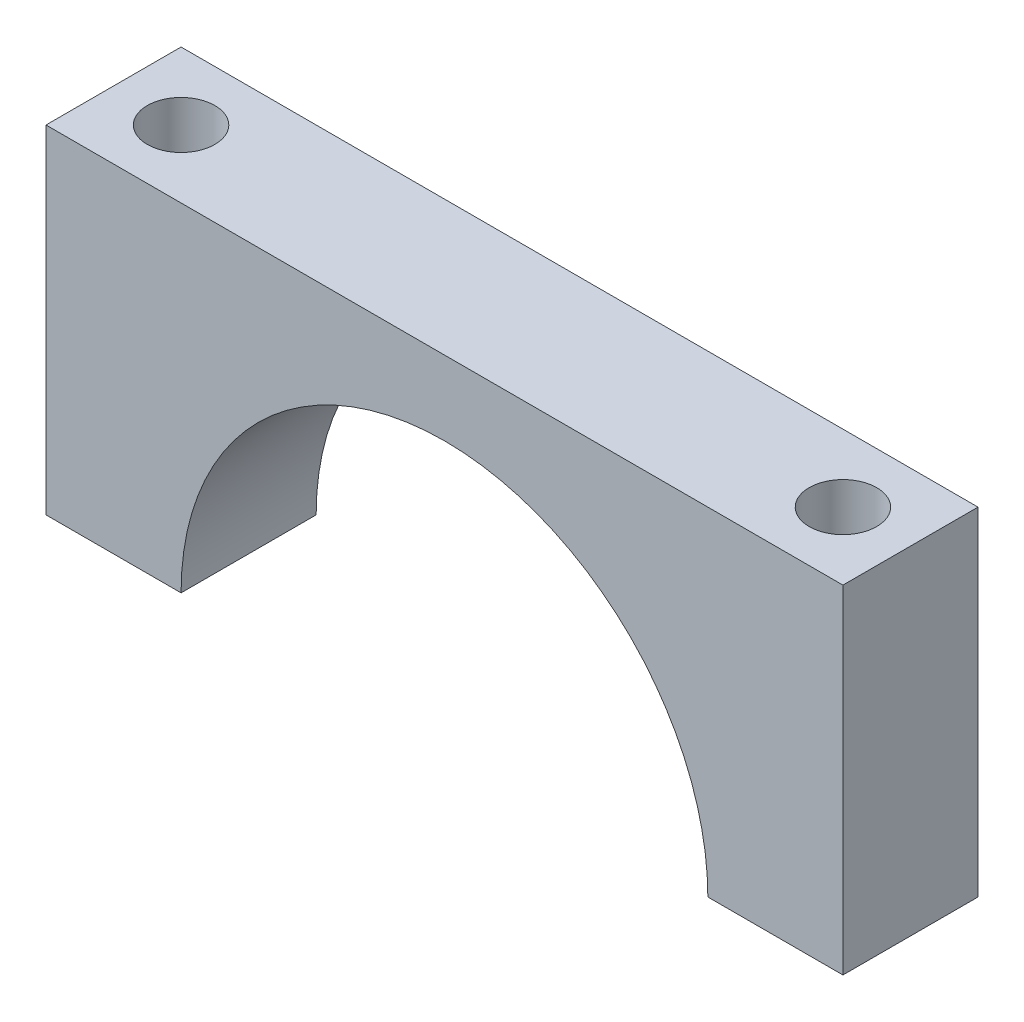
ISO-10303-21;
HEADER;
FILE_DESCRIPTION(('STEP AP214'),'2;1');
FILE_NAME('part.step','',(''),(''),'','','');
FILE_SCHEMA(('AUTOMOTIVE_DESIGN { 1 0 10303 214 1 1 1 1 }'));
ENDSEC;
DATA;
#1=APPLICATION_CONTEXT('core data for automotive mechanical design processes');
#2=APPLICATION_PROTOCOL_DEFINITION('international standard','automotive_design',2000,#1);
#3=PRODUCT_CONTEXT('',#1,'mechanical');
#4=PRODUCT('Part','Part','',(#3));
#5=PRODUCT_RELATED_PRODUCT_CATEGORY('part','',(#4));
#6=PRODUCT_DEFINITION_FORMATION('','',#4);
#7=PRODUCT_DEFINITION_CONTEXT('part definition',#1,'design');
#8=PRODUCT_DEFINITION('design','',#6,#7);
#9=PRODUCT_DEFINITION_SHAPE('','',#8);
#10=(LENGTH_UNIT() NAMED_UNIT(*) SI_UNIT(.MILLI.,.METRE.));
#11=(NAMED_UNIT(*) PLANE_ANGLE_UNIT() SI_UNIT($,.RADIAN.));
#12=(NAMED_UNIT(*) SI_UNIT($,.STERADIAN.) SOLID_ANGLE_UNIT());
#13=UNCERTAINTY_MEASURE_WITH_UNIT(LENGTH_MEASURE(1.E-05),#10,'distance_accuracy_value','');
#14=(GEOMETRIC_REPRESENTATION_CONTEXT(3) GLOBAL_UNCERTAINTY_ASSIGNED_CONTEXT((#13)) GLOBAL_UNIT_ASSIGNED_CONTEXT((#10,
#11,#12)) REPRESENTATION_CONTEXT('',''));
#15=CARTESIAN_POINT('',(0.,0.,0.));
#16=DIRECTION('',(0.,0.,1.));
#17=DIRECTION('',(1.,0.,0.));
#18=AXIS2_PLACEMENT_3D('',#15,#16,#17);
#19=CARTESIAN_POINT('',(0.,0.,10.));
#20=DIRECTION('',(0.,0.,-1.));
#21=DIRECTION('',(-1.,0.,0.));
#22=AXIS2_PLACEMENT_3D('',#19,#20,#21);
#23=CYLINDRICAL_SURFACE('',#22,19.5);
#24=CARTESIAN_POINT('',(0.,0.,0.));
#25=DIRECTION('',(0.,0.,-1.));
#26=DIRECTION('',(-1.,0.,0.));
#27=AXIS2_PLACEMENT_3D('',#24,#25,#26);
#28=CIRCLE('',#27,19.5);
#29=CARTESIAN_POINT('',(-19.5,0.,0.));
#30=VERTEX_POINT('',#29);
#31=CARTESIAN_POINT('',(19.5,0.,0.));
#32=VERTEX_POINT('',#31);
#33=EDGE_CURVE('E116',#30,#32,#28,.T.);
#34=ORIENTED_EDGE('',*,*,#33,.T.);
#35=DIRECTION('',(0.,0.,-1.));
#36=VECTOR('',#35,1.);
#37=CARTESIAN_POINT('',(19.5,0.,10.));
#38=LINE('',#37,#36);
#39=CARTESIAN_POINT('',(19.5,0.,10.));
#40=VERTEX_POINT('',#39);
#41=EDGE_CURVE('E11',#40,#32,#38,.T.);
#42=ORIENTED_EDGE('',*,*,#41,.F.);
#43=CARTESIAN_POINT('',(0.,0.,10.));
#44=DIRECTION('',(0.,0.,-1.));
#45=DIRECTION('',(-1.,0.,0.));
#46=AXIS2_PLACEMENT_3D('',#43,#44,#45);
#47=CIRCLE('',#46,19.5);
#48=CARTESIAN_POINT('',(-19.5,0.,10.));
#49=VERTEX_POINT('',#48);
#50=EDGE_CURVE('E127',#49,#40,#47,.T.);
#51=ORIENTED_EDGE('',*,*,#50,.F.);
#52=DIRECTION('',(0.,0.,-1.));
#53=VECTOR('',#52,1.);
#54=CARTESIAN_POINT('',(-19.5,0.,10.));
#55=LINE('',#54,#53);
#56=EDGE_CURVE('E112',#49,#30,#55,.T.);
#57=ORIENTED_EDGE('',*,*,#56,.T.);
#58=EDGE_LOOP('',(#34,#42,#51,#57));
#59=FACE_BOUND('',#58,.T.);
#60=ADVANCED_FACE('F32',(#59),#23,.F.);
#61=CARTESIAN_POINT('',(29.5,0.,10.));
#62=DIRECTION('',(0.,1.,0.));
#63=DIRECTION('',(0.,0.,1.));
#64=AXIS2_PLACEMENT_3D('',#61,#62,#63);
#65=PLANE('',#64);
#66=CARTESIAN_POINT('',(24.5,0.,5.));
#67=DIRECTION('',(0.,1.,0.));
#68=DIRECTION('',(0.,0.,1.));
#69=AXIS2_PLACEMENT_3D('',#66,#67,#68);
#70=CIRCLE('',#69,2.5);
#71=CARTESIAN_POINT('',(24.5,0.,7.5));
#72=VERTEX_POINT('',#71);
#73=EDGE_CURVE('E176',#72,#72,#70,.T.);
#74=ORIENTED_EDGE('',*,*,#73,.T.);
#75=EDGE_LOOP('',(#74));
#76=FACE_BOUND('',#75,.T.);
#77=DIRECTION('',(1.,0.,0.));
#78=VECTOR('',#77,1.);
#79=CARTESIAN_POINT('',(29.5,0.,0.));
#80=LINE('',#79,#78);
#81=CARTESIAN_POINT('',(29.5,0.,0.));
#82=VERTEX_POINT('',#81);
#83=EDGE_CURVE('E119',#32,#82,#80,.T.);
#84=ORIENTED_EDGE('',*,*,#83,.T.);
#85=DIRECTION('',(0.,0.,-1.));
#86=VECTOR('',#85,1.);
#87=CARTESIAN_POINT('',(29.5,0.,10.));
#88=LINE('',#87,#86);
#89=CARTESIAN_POINT('',(29.5,0.,10.));
#90=VERTEX_POINT('',#89);
#91=EDGE_CURVE('E40',#90,#82,#88,.T.);
#92=ORIENTED_EDGE('',*,*,#91,.F.);
#93=DIRECTION('',(1.,0.,0.));
#94=VECTOR('',#93,1.);
#95=CARTESIAN_POINT('',(29.5,0.,10.));
#96=LINE('',#95,#94);
#97=EDGE_CURVE('E85',#40,#90,#96,.T.);
#98=ORIENTED_EDGE('',*,*,#97,.F.);
#99=ORIENTED_EDGE('',*,*,#41,.T.);
#100=EDGE_LOOP('',(#84,#92,#98,#99));
#101=FACE_BOUND('',#100,.T.);
#102=ADVANCED_FACE('F153',(#76,#101),#65,.F.);
#103=CARTESIAN_POINT('',(29.5,25.,10.));
#104=DIRECTION('',(-1.,0.,0.));
#105=DIRECTION('',(0.,-1.,0.));
#106=AXIS2_PLACEMENT_3D('',#103,#104,#105);
#107=PLANE('',#106);
#108=DIRECTION('',(0.,1.,0.));
#109=VECTOR('',#108,1.);
#110=CARTESIAN_POINT('',(29.5,25.,0.));
#111=LINE('',#110,#109);
#112=CARTESIAN_POINT('',(29.5,25.,0.));
#113=VERTEX_POINT('',#112);
#114=EDGE_CURVE('E122',#82,#113,#111,.T.);
#115=ORIENTED_EDGE('',*,*,#114,.T.);
#116=DIRECTION('',(0.,0.,-1.));
#117=VECTOR('',#116,1.);
#118=CARTESIAN_POINT('',(29.5,25.,10.));
#119=LINE('',#118,#117);
#120=CARTESIAN_POINT('',(29.5,25.,10.));
#121=VERTEX_POINT('',#120);
#122=EDGE_CURVE('E107',#121,#113,#119,.T.);
#123=ORIENTED_EDGE('',*,*,#122,.F.);
#124=DIRECTION('',(0.,1.,0.));
#125=VECTOR('',#124,1.);
#126=CARTESIAN_POINT('',(29.5,25.,10.));
#127=LINE('',#126,#125);
#128=EDGE_CURVE('E98',#90,#121,#127,.T.);
#129=ORIENTED_EDGE('',*,*,#128,.F.);
#130=ORIENTED_EDGE('',*,*,#91,.T.);
#131=EDGE_LOOP('',(#115,#123,#129,#130));
#132=FACE_BOUND('',#131,.T.);
#133=ADVANCED_FACE('F133',(#132),#107,.F.);
#134=CARTESIAN_POINT('',(-29.5,25.,10.));
#135=DIRECTION('',(0.,-1.,0.));
#136=DIRECTION('',(0.,0.,-1.));
#137=AXIS2_PLACEMENT_3D('',#134,#135,#136);
#138=PLANE('',#137);
#139=CARTESIAN_POINT('',(-24.5,25.,5.));
#140=DIRECTION('',(0.,1.,0.));
#141=DIRECTION('',(0.,0.,1.));
#142=AXIS2_PLACEMENT_3D('',#139,#140,#141);
#143=CIRCLE('',#142,2.5);
#144=CARTESIAN_POINT('',(-24.5,25.,7.5));
#145=VERTEX_POINT('',#144);
#146=EDGE_CURVE('E120',#145,#145,#143,.T.);
#147=ORIENTED_EDGE('',*,*,#146,.F.);
#148=EDGE_LOOP('',(#147));
#149=FACE_BOUND('',#148,.T.);
#150=CARTESIAN_POINT('',(24.5,25.,5.));
#151=DIRECTION('',(0.,1.,0.));
#152=DIRECTION('',(0.,0.,1.));
#153=AXIS2_PLACEMENT_3D('',#150,#151,#152);
#154=CIRCLE('',#153,2.5);
#155=CARTESIAN_POINT('',(24.5,25.,7.5));
#156=VERTEX_POINT('',#155);
#157=EDGE_CURVE('E173',#156,#156,#154,.T.);
#158=ORIENTED_EDGE('',*,*,#157,.F.);
#159=EDGE_LOOP('',(#158));
#160=FACE_BOUND('',#159,.T.);
#161=DIRECTION('',(-1.,0.,0.));
#162=VECTOR('',#161,1.);
#163=CARTESIAN_POINT('',(-29.5,25.,0.));
#164=LINE('',#163,#162);
#165=CARTESIAN_POINT('',(-29.5,25.,0.));
#166=VERTEX_POINT('',#165);
#167=EDGE_CURVE('E106',#113,#166,#164,.T.);
#168=ORIENTED_EDGE('',*,*,#167,.T.);
#169=DIRECTION('',(0.,0.,-1.));
#170=VECTOR('',#169,1.);
#171=CARTESIAN_POINT('',(-29.5,25.,10.));
#172=LINE('',#171,#170);
#173=CARTESIAN_POINT('',(-29.5,25.,10.));
#174=VERTEX_POINT('',#173);
#175=EDGE_CURVE('E103',#174,#166,#172,.T.);
#176=ORIENTED_EDGE('',*,*,#175,.F.);
#177=DIRECTION('',(-1.,0.,0.));
#178=VECTOR('',#177,1.);
#179=CARTESIAN_POINT('',(-29.5,25.,10.));
#180=LINE('',#179,#178);
#181=EDGE_CURVE('E92',#121,#174,#180,.T.);
#182=ORIENTED_EDGE('',*,*,#181,.F.);
#183=ORIENTED_EDGE('',*,*,#122,.T.);
#184=EDGE_LOOP('',(#168,#176,#182,#183));
#185=FACE_BOUND('',#184,.T.);
#186=ADVANCED_FACE('F104',(#149,#160,#185),#138,.F.);
#187=CARTESIAN_POINT('',(-29.5,0.,10.));
#188=DIRECTION('',(1.,0.,0.));
#189=DIRECTION('',(0.,0.,-1.));
#190=AXIS2_PLACEMENT_3D('',#187,#188,#189);
#191=PLANE('',#190);
#192=DIRECTION('',(0.,-1.,0.));
#193=VECTOR('',#192,1.);
#194=CARTESIAN_POINT('',(-29.5,0.,0.));
#195=LINE('',#194,#193);
#196=CARTESIAN_POINT('',(-29.5,0.,0.));
#197=VERTEX_POINT('',#196);
#198=EDGE_CURVE('E71',#166,#197,#195,.T.);
#199=ORIENTED_EDGE('',*,*,#198,.T.);
#200=DIRECTION('',(0.,0.,-1.));
#201=VECTOR('',#200,1.);
#202=CARTESIAN_POINT('',(-29.5,0.,10.));
#203=LINE('',#202,#201);
#204=CARTESIAN_POINT('',(-29.5,0.,10.));
#205=VERTEX_POINT('',#204);
#206=EDGE_CURVE('E108',#205,#197,#203,.T.);
#207=ORIENTED_EDGE('',*,*,#206,.F.);
#208=DIRECTION('',(0.,-1.,0.));
#209=VECTOR('',#208,1.);
#210=CARTESIAN_POINT('',(-29.5,0.,10.));
#211=LINE('',#210,#209);
#212=EDGE_CURVE('E96',#174,#205,#211,.T.);
#213=ORIENTED_EDGE('',*,*,#212,.F.);
#214=ORIENTED_EDGE('',*,*,#175,.T.);
#215=EDGE_LOOP('',(#199,#207,#213,#214));
#216=FACE_BOUND('',#215,.T.);
#217=ADVANCED_FACE('F110',(#216),#191,.F.);
#218=CARTESIAN_POINT('',(-19.5,0.,10.));
#219=DIRECTION('',(0.,1.,0.));
#220=DIRECTION('',(0.,0.,1.));
#221=AXIS2_PLACEMENT_3D('',#218,#219,#220);
#222=PLANE('',#221);
#223=CARTESIAN_POINT('',(-24.5,0.,5.));
#224=DIRECTION('',(0.,1.,0.));
#225=DIRECTION('',(0.,0.,1.));
#226=AXIS2_PLACEMENT_3D('',#223,#224,#225);
#227=CIRCLE('',#226,2.5);
#228=CARTESIAN_POINT('',(-24.5,0.,7.5));
#229=VERTEX_POINT('',#228);
#230=EDGE_CURVE('E175',#229,#229,#227,.T.);
#231=ORIENTED_EDGE('',*,*,#230,.T.);
#232=EDGE_LOOP('',(#231));
#233=FACE_BOUND('',#232,.T.);
#234=DIRECTION('',(1.,0.,0.));
#235=VECTOR('',#234,1.);
#236=CARTESIAN_POINT('',(-19.5,0.,0.));
#237=LINE('',#236,#235);
#238=EDGE_CURVE('E77',#197,#30,#237,.T.);
#239=ORIENTED_EDGE('',*,*,#238,.T.);
#240=ORIENTED_EDGE('',*,*,#56,.F.);
#241=DIRECTION('',(1.,0.,0.));
#242=VECTOR('',#241,1.);
#243=CARTESIAN_POINT('',(-19.5,0.,10.));
#244=LINE('',#243,#242);
#245=EDGE_CURVE('E48',#205,#49,#244,.T.);
#246=ORIENTED_EDGE('',*,*,#245,.F.);
#247=ORIENTED_EDGE('',*,*,#206,.T.);
#248=EDGE_LOOP('',(#239,#240,#246,#247));
#249=FACE_BOUND('',#248,.T.);
#250=ADVANCED_FACE('F140',(#233,#249),#222,.F.);
#251=CARTESIAN_POINT('',(0.,0.,10.));
#252=DIRECTION('',(0.,0.,-1.));
#253=DIRECTION('',(-1.,0.,0.));
#254=AXIS2_PLACEMENT_3D('',#251,#252,#253);
#255=PLANE('',#254);
#256=ORIENTED_EDGE('',*,*,#50,.T.);
#257=ORIENTED_EDGE('',*,*,#97,.T.);
#258=ORIENTED_EDGE('',*,*,#128,.T.);
#259=ORIENTED_EDGE('',*,*,#181,.T.);
#260=ORIENTED_EDGE('',*,*,#212,.T.);
#261=ORIENTED_EDGE('',*,*,#245,.T.);
#262=EDGE_LOOP('',(#256,#257,#258,#259,#260,#261));
#263=FACE_BOUND('',#262,.T.);
#264=ADVANCED_FACE('F94',(#263),#255,.F.);
#265=CARTESIAN_POINT('',(0.,0.,0.));
#266=DIRECTION('',(0.,0.,-1.));
#267=DIRECTION('',(-1.,0.,0.));
#268=AXIS2_PLACEMENT_3D('',#265,#266,#267);
#269=PLANE('',#268);
#270=ORIENTED_EDGE('',*,*,#33,.F.);
#271=ORIENTED_EDGE('',*,*,#238,.F.);
#272=ORIENTED_EDGE('',*,*,#198,.F.);
#273=ORIENTED_EDGE('',*,*,#167,.F.);
#274=ORIENTED_EDGE('',*,*,#114,.F.);
#275=ORIENTED_EDGE('',*,*,#83,.F.);
#276=EDGE_LOOP('',(#270,#271,#272,#273,#274,#275));
#277=FACE_BOUND('',#276,.T.);
#278=ADVANCED_FACE('F136',(#277),#269,.T.);
#279=CARTESIAN_POINT('',(-24.5,25.,5.));
#280=DIRECTION('',(0.,-1.,0.));
#281=DIRECTION('',(0.,0.,-1.));
#282=AXIS2_PLACEMENT_3D('',#279,#280,#281);
#283=CYLINDRICAL_SURFACE('',#282,2.5);
#284=ORIENTED_EDGE('',*,*,#146,.T.);
#285=EDGE_LOOP('',(#284));
#286=FACE_BOUND('',#285,.T.);
#287=ORIENTED_EDGE('',*,*,#230,.F.);
#288=EDGE_LOOP('',(#287));
#289=FACE_BOUND('',#288,.T.);
#290=ADVANCED_FACE('F184',(#286,#289),#283,.F.);
#291=CARTESIAN_POINT('',(24.5,25.,5.));
#292=DIRECTION('',(0.,-1.,0.));
#293=DIRECTION('',(0.,0.,-1.));
#294=AXIS2_PLACEMENT_3D('',#291,#292,#293);
#295=CYLINDRICAL_SURFACE('',#294,2.5);
#296=ORIENTED_EDGE('',*,*,#157,.T.);
#297=EDGE_LOOP('',(#296));
#298=FACE_BOUND('',#297,.T.);
#299=ORIENTED_EDGE('',*,*,#73,.F.);
#300=EDGE_LOOP('',(#299));
#301=FACE_BOUND('',#300,.T.);
#302=ADVANCED_FACE('F187',(#298,#301),#295,.F.);
#303=CLOSED_SHELL('',(#60,#102,#133,#186,#217,#250,#264,#278,#290,#302));
#304=MANIFOLD_SOLID_BREP('B2',#303);
#305=ADVANCED_BREP_SHAPE_REPRESENTATION('',(#18,#304),#14);
#306=SHAPE_DEFINITION_REPRESENTATION(#9,#305);
ENDSEC;
END-ISO-10303-21;
